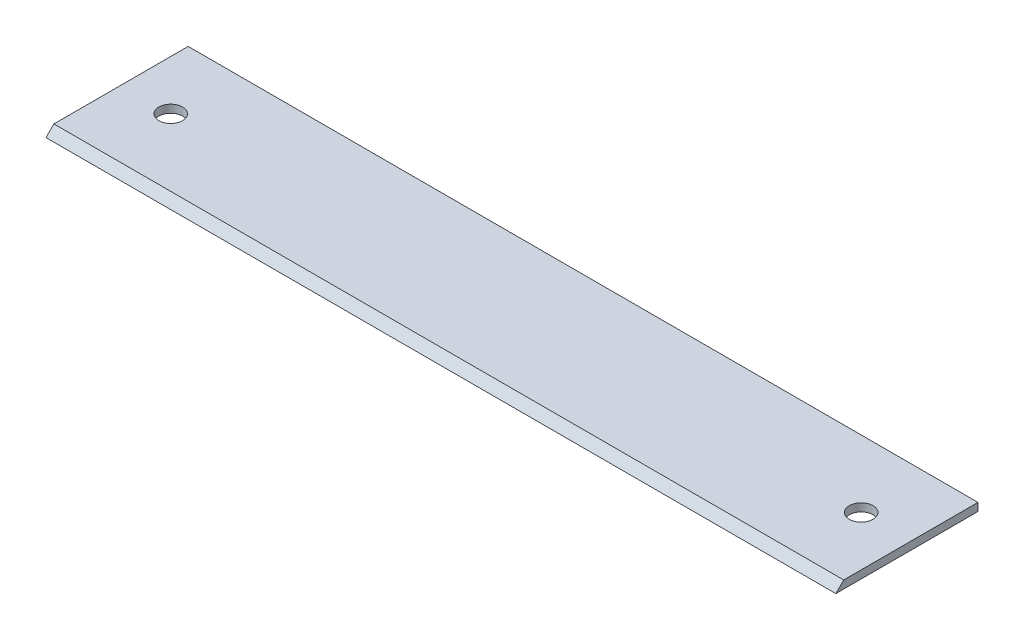
ISO-10303-21;
HEADER;
FILE_DESCRIPTION(('STEP AP214'),'2;1');
FILE_NAME('part.step','',(''),(''),'','','');
FILE_SCHEMA(('AUTOMOTIVE_DESIGN { 1 0 10303 214 1 1 1 1 }'));
ENDSEC;
DATA;
#1=APPLICATION_CONTEXT('core data for automotive mechanical design processes');
#2=APPLICATION_PROTOCOL_DEFINITION('international standard','automotive_design',2000,#1);
#3=PRODUCT_CONTEXT('',#1,'mechanical');
#4=PRODUCT('Part','Part','',(#3));
#5=PRODUCT_RELATED_PRODUCT_CATEGORY('part','',(#4));
#6=PRODUCT_DEFINITION_FORMATION('','',#4);
#7=PRODUCT_DEFINITION_CONTEXT('part definition',#1,'design');
#8=PRODUCT_DEFINITION('design','',#6,#7);
#9=PRODUCT_DEFINITION_SHAPE('','',#8);
#10=(LENGTH_UNIT() NAMED_UNIT(*) SI_UNIT(.MILLI.,.METRE.));
#11=(NAMED_UNIT(*) PLANE_ANGLE_UNIT() SI_UNIT($,.RADIAN.));
#12=(NAMED_UNIT(*) SI_UNIT($,.STERADIAN.) SOLID_ANGLE_UNIT());
#13=UNCERTAINTY_MEASURE_WITH_UNIT(LENGTH_MEASURE(1.E-05),#10,'distance_accuracy_value','');
#14=(GEOMETRIC_REPRESENTATION_CONTEXT(3) GLOBAL_UNCERTAINTY_ASSIGNED_CONTEXT((#13)) GLOBAL_UNIT_ASSIGNED_CONTEXT((#10,
#11,#12)) REPRESENTATION_CONTEXT('',''));
#15=CARTESIAN_POINT('',(0.,0.,0.));
#16=DIRECTION('',(0.,0.,1.));
#17=DIRECTION('',(1.,0.,0.));
#18=AXIS2_PLACEMENT_3D('',#15,#16,#17);
#19=CARTESIAN_POINT('',(50.,1.,9.));
#20=DIRECTION('',(-1.,0.,0.));
#21=DIRECTION('',(0.,0.,1.));
#22=AXIS2_PLACEMENT_3D('',#19,#20,#21);
#23=PLANE('',#22);
#24=DIRECTION('',(0.,0.,-1.));
#25=VECTOR('',#24,1.);
#26=CARTESIAN_POINT('',(50.,1.,9.));
#27=LINE('',#26,#25);
#28=CARTESIAN_POINT('',(50.,1.,8.));
#29=VERTEX_POINT('',#28);
#30=CARTESIAN_POINT('',(50.,1.,-9.));
#31=VERTEX_POINT('',#30);
#32=EDGE_CURVE('E75',#29,#31,#27,.T.);
#33=ORIENTED_EDGE('',*,*,#32,.F.);
#34=DIRECTION('',(0.,0.707106781186548,-0.707106781186548));
#35=VECTOR('',#34,1.);
#36=CARTESIAN_POINT('',(50.,1.,8.));
#37=LINE('',#36,#35);
#38=CARTESIAN_POINT('',(50.,0.,9.));
#39=VERTEX_POINT('',#38);
#40=EDGE_CURVE('E43',#29,#39,#37,.F.);
#41=ORIENTED_EDGE('',*,*,#40,.T.);
#42=DIRECTION('',(0.,0.,-1.));
#43=VECTOR('',#42,1.);
#44=CARTESIAN_POINT('',(50.,0.,9.));
#45=LINE('',#44,#43);
#46=CARTESIAN_POINT('',(50.,0.,-9.));
#47=VERTEX_POINT('',#46);
#48=EDGE_CURVE('E95',#39,#47,#45,.T.);
#49=ORIENTED_EDGE('',*,*,#48,.T.);
#50=DIRECTION('',(0.,-1.,0.));
#51=VECTOR('',#50,1.);
#52=CARTESIAN_POINT('',(50.,1.,-9.));
#53=LINE('',#52,#51);
#54=EDGE_CURVE('E88',#31,#47,#53,.T.);
#55=ORIENTED_EDGE('',*,*,#54,.F.);
#56=EDGE_LOOP('',(#33,#41,#49,#55));
#57=FACE_BOUND('',#56,.T.);
#58=ADVANCED_FACE('F34',(#57),#23,.F.);
#59=CARTESIAN_POINT('',(-50.,1.,-9.));
#60=DIRECTION('',(0.,0.,1.));
#61=DIRECTION('',(1.,0.,0.));
#62=AXIS2_PLACEMENT_3D('',#59,#60,#61);
#63=PLANE('',#62);
#64=DIRECTION('',(-1.,0.,0.));
#65=VECTOR('',#64,1.);
#66=CARTESIAN_POINT('',(-50.,0.,-9.));
#67=LINE('',#66,#65);
#68=CARTESIAN_POINT('',(-50.,0.,-9.));
#69=VERTEX_POINT('',#68);
#70=EDGE_CURVE('E117',#47,#69,#67,.T.);
#71=ORIENTED_EDGE('',*,*,#70,.T.);
#72=DIRECTION('',(0.,-1.,0.));
#73=VECTOR('',#72,1.);
#74=CARTESIAN_POINT('',(-50.,1.,-9.));
#75=LINE('',#74,#73);
#76=CARTESIAN_POINT('',(-50.,1.,-9.));
#77=VERTEX_POINT('',#76);
#78=EDGE_CURVE('E91',#77,#69,#75,.T.);
#79=ORIENTED_EDGE('',*,*,#78,.F.);
#80=DIRECTION('',(-1.,0.,0.));
#81=VECTOR('',#80,1.);
#82=CARTESIAN_POINT('',(-50.,1.,-9.));
#83=LINE('',#82,#81);
#84=EDGE_CURVE('E78',#31,#77,#83,.T.);
#85=ORIENTED_EDGE('',*,*,#84,.F.);
#86=ORIENTED_EDGE('',*,*,#54,.T.);
#87=EDGE_LOOP('',(#71,#79,#85,#86));
#88=FACE_BOUND('',#87,.T.);
#89=ADVANCED_FACE('F87',(#88),#63,.F.);
#90=CARTESIAN_POINT('',(-50.,1.,9.));
#91=DIRECTION('',(1.,0.,0.));
#92=DIRECTION('',(0.,0.,-1.));
#93=AXIS2_PLACEMENT_3D('',#90,#91,#92);
#94=PLANE('',#93);
#95=DIRECTION('',(0.,0.,1.));
#96=VECTOR('',#95,1.);
#97=CARTESIAN_POINT('',(-50.,0.,9.));
#98=LINE('',#97,#96);
#99=CARTESIAN_POINT('',(-50.,0.,9.));
#100=VERTEX_POINT('',#99);
#101=EDGE_CURVE('E119',#69,#100,#98,.T.);
#102=ORIENTED_EDGE('',*,*,#101,.T.);
#103=DIRECTION('',(0.,-0.707106781186548,0.707106781186548));
#104=VECTOR('',#103,1.);
#105=CARTESIAN_POINT('',(-50.,1.,8.));
#106=LINE('',#105,#104);
#107=CARTESIAN_POINT('',(-50.,1.,8.));
#108=VERTEX_POINT('',#107);
#109=EDGE_CURVE('E11',#100,#108,#106,.F.);
#110=ORIENTED_EDGE('',*,*,#109,.T.);
#111=DIRECTION('',(0.,0.,1.));
#112=VECTOR('',#111,1.);
#113=CARTESIAN_POINT('',(-50.,1.,9.));
#114=LINE('',#113,#112);
#115=EDGE_CURVE('E92',#77,#108,#114,.T.);
#116=ORIENTED_EDGE('',*,*,#115,.F.);
#117=ORIENTED_EDGE('',*,*,#78,.T.);
#118=EDGE_LOOP('',(#102,#110,#116,#117));
#119=FACE_BOUND('',#118,.T.);
#120=ADVANCED_FACE('F124',(#119),#94,.F.);
#121=CARTESIAN_POINT('',(0.,1.,0.));
#122=DIRECTION('',(0.,-1.,0.));
#123=DIRECTION('',(0.,0.,-1.));
#124=AXIS2_PLACEMENT_3D('',#121,#122,#123);
#125=PLANE('',#124);
#126=CARTESIAN_POINT('',(-43.7096798806038,1.,-0.5));
#127=DIRECTION('',(0.,1.,0.));
#128=DIRECTION('',(0.,0.,1.));
#129=AXIS2_PLACEMENT_3D('',#126,#127,#128);
#130=CIRCLE('',#129,1.5);
#131=CARTESIAN_POINT('',(-43.7096798806038,1.,1.));
#132=VERTEX_POINT('',#131);
#133=EDGE_CURVE('E103',#132,#132,#130,.T.);
#134=ORIENTED_EDGE('',*,*,#133,.F.);
#135=EDGE_LOOP('',(#134));
#136=FACE_BOUND('',#135,.T.);
#137=CARTESIAN_POINT('',(43.7096798806038,1.,-0.5));
#138=DIRECTION('',(0.,1.,0.));
#139=DIRECTION('',(0.,0.,-1.));
#140=AXIS2_PLACEMENT_3D('',#137,#138,#139);
#141=CIRCLE('',#140,1.5);
#142=CARTESIAN_POINT('',(43.7096798806038,1.,-2.));
#143=VERTEX_POINT('',#142);
#144=EDGE_CURVE('E108',#143,#143,#141,.T.);
#145=ORIENTED_EDGE('',*,*,#144,.F.);
#146=EDGE_LOOP('',(#145));
#147=FACE_BOUND('',#146,.T.);
#148=ORIENTED_EDGE('',*,*,#115,.T.);
#149=DIRECTION('',(1.,0.,0.));
#150=VECTOR('',#149,1.);
#151=CARTESIAN_POINT('',(0.,1.,8.));
#152=LINE('',#151,#150);
#153=EDGE_CURVE('E80',#108,#29,#152,.T.);
#154=ORIENTED_EDGE('',*,*,#153,.T.);
#155=ORIENTED_EDGE('',*,*,#32,.T.);
#156=ORIENTED_EDGE('',*,*,#84,.T.);
#157=EDGE_LOOP('',(#148,#154,#155,#156));
#158=FACE_BOUND('',#157,.T.);
#159=ADVANCED_FACE('F77',(#136,#147,#158),#125,.F.);
#160=CARTESIAN_POINT('',(0.,0.,0.));
#161=DIRECTION('',(0.,-1.,0.));
#162=DIRECTION('',(0.,0.,-1.));
#163=AXIS2_PLACEMENT_3D('',#160,#161,#162);
#164=PLANE('',#163);
#165=CARTESIAN_POINT('',(-43.7096798806038,0.,-0.5));
#166=DIRECTION('',(0.,-1.,0.));
#167=DIRECTION('',(0.,0.,-1.));
#168=AXIS2_PLACEMENT_3D('',#165,#166,#167);
#169=CIRCLE('',#168,1.5);
#170=CARTESIAN_POINT('',(-43.7096798806038,0.,-2.));
#171=VERTEX_POINT('',#170);
#172=EDGE_CURVE('E38',#171,#171,#169,.T.);
#173=ORIENTED_EDGE('',*,*,#172,.F.);
#174=EDGE_LOOP('',(#173));
#175=FACE_BOUND('',#174,.T.);
#176=CARTESIAN_POINT('',(43.7096798806038,0.,-0.5));
#177=DIRECTION('',(0.,-1.,0.));
#178=DIRECTION('',(0.,0.,-1.));
#179=AXIS2_PLACEMENT_3D('',#176,#177,#178);
#180=CIRCLE('',#179,1.5);
#181=CARTESIAN_POINT('',(43.7096798806038,0.,-2.));
#182=VERTEX_POINT('',#181);
#183=EDGE_CURVE('E101',#182,#182,#180,.T.);
#184=ORIENTED_EDGE('',*,*,#183,.F.);
#185=EDGE_LOOP('',(#184));
#186=FACE_BOUND('',#185,.T.);
#187=ORIENTED_EDGE('',*,*,#48,.F.);
#188=DIRECTION('',(1.,0.,0.));
#189=VECTOR('',#188,1.);
#190=CARTESIAN_POINT('',(-50.,0.,9.));
#191=LINE('',#190,#189);
#192=EDGE_CURVE('E83',#100,#39,#191,.T.);
#193=ORIENTED_EDGE('',*,*,#192,.F.);
#194=ORIENTED_EDGE('',*,*,#101,.F.);
#195=ORIENTED_EDGE('',*,*,#70,.F.);
#196=EDGE_LOOP('',(#187,#193,#194,#195));
#197=FACE_BOUND('',#196,.T.);
#198=ADVANCED_FACE('F123',(#175,#186,#197),#164,.T.);
#199=CARTESIAN_POINT('',(0.,1.,8.));
#200=DIRECTION('',(0.,-0.707106781186547,-0.707106781186547));
#201=DIRECTION('',(1.,0.,0.));
#202=AXIS2_PLACEMENT_3D('',#199,#200,#201);
#203=PLANE('',#202);
#204=ORIENTED_EDGE('',*,*,#109,.F.);
#205=ORIENTED_EDGE('',*,*,#192,.T.);
#206=ORIENTED_EDGE('',*,*,#40,.F.);
#207=ORIENTED_EDGE('',*,*,#153,.F.);
#208=EDGE_LOOP('',(#204,#205,#206,#207));
#209=FACE_BOUND('',#208,.T.);
#210=ADVANCED_FACE('F36',(#209),#203,.F.);
#211=CARTESIAN_POINT('',(43.7096798806038,-19.,-0.5));
#212=DIRECTION('',(0.,1.,0.));
#213=DIRECTION('',(0.,0.,1.));
#214=AXIS2_PLACEMENT_3D('',#211,#212,#213);
#215=CYLINDRICAL_SURFACE('',#214,1.5);
#216=ORIENTED_EDGE('',*,*,#183,.T.);
#217=EDGE_LOOP('',(#216));
#218=FACE_BOUND('',#217,.T.);
#219=ORIENTED_EDGE('',*,*,#144,.T.);
#220=EDGE_LOOP('',(#219));
#221=FACE_BOUND('',#220,.T.);
#222=ADVANCED_FACE('F171',(#218,#221),#215,.F.);
#223=CARTESIAN_POINT('',(-43.7096798806038,-19.,-0.5));
#224=DIRECTION('',(0.,1.,0.));
#225=DIRECTION('',(0.,0.,1.));
#226=AXIS2_PLACEMENT_3D('',#223,#224,#225);
#227=CYLINDRICAL_SURFACE('',#226,1.5);
#228=ORIENTED_EDGE('',*,*,#172,.T.);
#229=EDGE_LOOP('',(#228));
#230=FACE_BOUND('',#229,.T.);
#231=ORIENTED_EDGE('',*,*,#133,.T.);
#232=EDGE_LOOP('',(#231));
#233=FACE_BOUND('',#232,.T.);
#234=ADVANCED_FACE('F177',(#230,#233),#227,.F.);
#235=CLOSED_SHELL('',(#58,#89,#120,#159,#198,#210,#222,#234));
#236=MANIFOLD_SOLID_BREP('B2',#235);
#237=ADVANCED_BREP_SHAPE_REPRESENTATION('',(#18,#236),#14);
#238=SHAPE_DEFINITION_REPRESENTATION(#9,#237);
ENDSEC;
END-ISO-10303-21;
